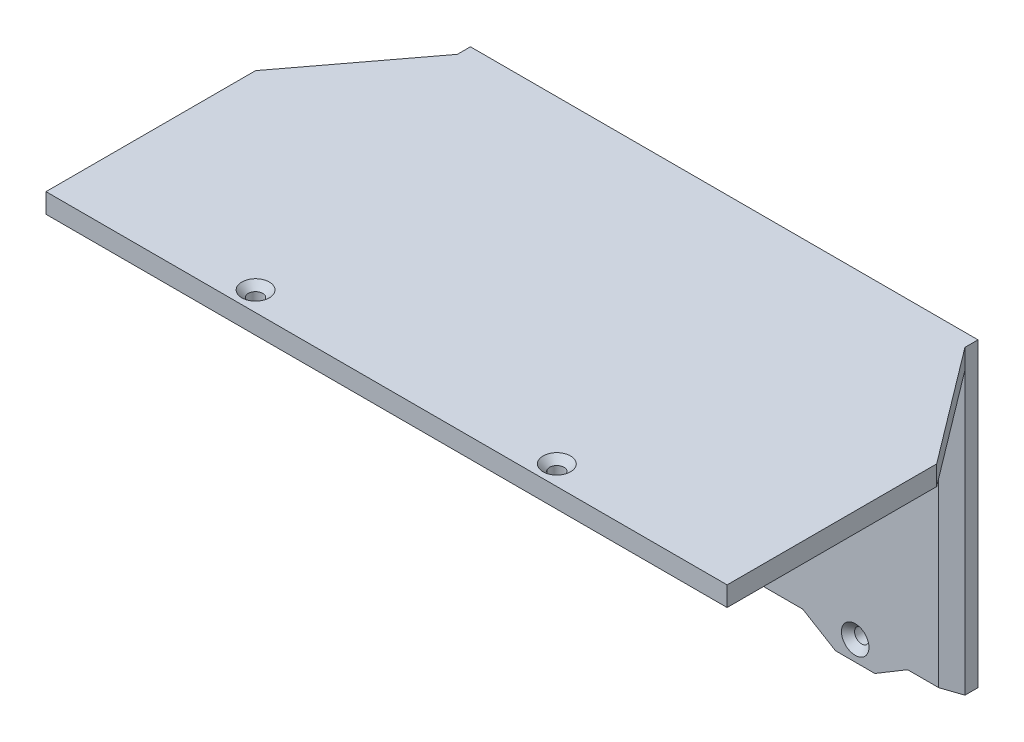
ISO-10303-21;
HEADER;
FILE_DESCRIPTION(('STEP AP214'),'2;1');
FILE_NAME('part.step','',(''),(''),'','','');
FILE_SCHEMA(('AUTOMOTIVE_DESIGN { 1 0 10303 214 1 1 1 1 }'));
ENDSEC;
DATA;
#1=APPLICATION_CONTEXT('core data for automotive mechanical design processes');
#2=APPLICATION_PROTOCOL_DEFINITION('international standard','automotive_design',2000,#1);
#3=PRODUCT_CONTEXT('',#1,'mechanical');
#4=PRODUCT('Part','Part','',(#3));
#5=PRODUCT_RELATED_PRODUCT_CATEGORY('part','',(#4));
#6=PRODUCT_DEFINITION_FORMATION('','',#4);
#7=PRODUCT_DEFINITION_CONTEXT('part definition',#1,'design');
#8=PRODUCT_DEFINITION('design','',#6,#7);
#9=PRODUCT_DEFINITION_SHAPE('','',#8);
#10=(LENGTH_UNIT() NAMED_UNIT(*) SI_UNIT(.MILLI.,.METRE.));
#11=(NAMED_UNIT(*) PLANE_ANGLE_UNIT() SI_UNIT($,.RADIAN.));
#12=(NAMED_UNIT(*) SI_UNIT($,.STERADIAN.) SOLID_ANGLE_UNIT());
#13=UNCERTAINTY_MEASURE_WITH_UNIT(LENGTH_MEASURE(1.E-05),#10,'distance_accuracy_value','');
#14=(GEOMETRIC_REPRESENTATION_CONTEXT(3) GLOBAL_UNCERTAINTY_ASSIGNED_CONTEXT((#13)) GLOBAL_UNIT_ASSIGNED_CONTEXT((#10,
#11,#12)) REPRESENTATION_CONTEXT('',''));
#15=CARTESIAN_POINT('',(0.,0.,0.));
#16=DIRECTION('',(0.,0.,1.));
#17=DIRECTION('',(1.,0.,0.));
#18=AXIS2_PLACEMENT_3D('',#15,#16,#17);
#19=CARTESIAN_POINT('',(0.,3.,0.));
#20=DIRECTION('',(0.,1.,0.));
#21=DIRECTION('',(0.,0.,1.));
#22=AXIS2_PLACEMENT_3D('',#19,#20,#21);
#23=PLANE('',#22);
#24=CARTESIAN_POINT('',(23.0000000000002,3.,72.7452578391736));
#25=DIRECTION('',(0.,1.,0.));
#26=DIRECTION('',(0.,0.,1.));
#27=AXIS2_PLACEMENT_3D('',#24,#25,#26);
#28=CIRCLE('',#27,2.09999999999998);
#29=CARTESIAN_POINT('',(23.0000000000002,3.,74.8452578391735));
#30=VERTEX_POINT('',#29);
#31=EDGE_CURVE('E330',#30,#30,#28,.F.);
#32=ORIENTED_EDGE('',*,*,#31,.T.);
#33=EDGE_LOOP('',(#32));
#34=FACE_BOUND('',#33,.T.);
#35=CARTESIAN_POINT('',(-22.9999999999998,3.,72.7452578391736));
#36=DIRECTION('',(0.,1.,0.));
#37=DIRECTION('',(0.,0.,1.));
#38=AXIS2_PLACEMENT_3D('',#35,#36,#37);
#39=CIRCLE('',#38,2.09999999999999);
#40=CARTESIAN_POINT('',(-22.9999999999998,3.,74.8452578391735));
#41=VERTEX_POINT('',#40);
#42=EDGE_CURVE('E318',#41,#41,#39,.F.);
#43=ORIENTED_EDGE('',*,*,#42,.T.);
#44=EDGE_LOOP('',(#43));
#45=FACE_BOUND('',#44,.T.);
#46=DIRECTION('',(0.602272727272727,0.,0.798290399531068));
#47=VECTOR('',#46,1.);
#48=CARTESIAN_POINT('',(12.1056947461493,3.,-9.13317984855799));
#49=LINE('',#48,#47);
#50=CARTESIAN_POINT('',(38.7500000000002,3.,26.1828690494901));
#51=VERTEX_POINT('',#50);
#52=CARTESIAN_POINT('',(52.0000000000002,3.,43.7452578391736));
#53=VERTEX_POINT('',#52);
#54=EDGE_CURVE('E246',#51,#53,#49,.T.);
#55=ORIENTED_EDGE('',*,*,#54,.F.);
#56=DIRECTION('',(0.,0.,1.));
#57=VECTOR('',#56,1.);
#58=CARTESIAN_POINT('',(38.7500000000002,3.,0.));
#59=LINE('',#58,#57);
#60=CARTESIAN_POINT('',(38.7500000000002,3.,24.1876112103165));
#61=VERTEX_POINT('',#60);
#62=EDGE_CURVE('E250',#61,#51,#59,.T.);
#63=ORIENTED_EDGE('',*,*,#62,.F.);
#64=DIRECTION('',(1.,0.,0.));
#65=VECTOR('',#64,1.);
#66=CARTESIAN_POINT('',(0.,3.,24.1876112103165));
#67=LINE('',#66,#65);
#68=CARTESIAN_POINT('',(-38.7499999999998,3.,24.1876112103165));
#69=VERTEX_POINT('',#68);
#70=EDGE_CURVE('E255',#69,#61,#67,.T.);
#71=ORIENTED_EDGE('',*,*,#70,.F.);
#72=DIRECTION('',(0.,0.,1.));
#73=VECTOR('',#72,1.);
#74=CARTESIAN_POINT('',(-38.7499999999998,3.,0.));
#75=LINE('',#74,#73);
#76=CARTESIAN_POINT('',(-38.7499999999998,3.,26.1828690494901));
#77=VERTEX_POINT('',#76);
#78=EDGE_CURVE('E259',#69,#77,#75,.T.);
#79=ORIENTED_EDGE('',*,*,#78,.T.);
#80=DIRECTION('',(-0.602272727272728,0.,0.798290399531067));
#81=VECTOR('',#80,1.);
#82=CARTESIAN_POINT('',(-12.105694746149,3.,-9.13317984855776));
#83=LINE('',#82,#81);
#84=CARTESIAN_POINT('',(-51.9999999999998,3.,43.7452578391736));
#85=VERTEX_POINT('',#84);
#86=EDGE_CURVE('E262',#77,#85,#83,.T.);
#87=ORIENTED_EDGE('',*,*,#86,.T.);
#88=DIRECTION('',(0.,0.,1.));
#89=VECTOR('',#88,1.);
#90=CARTESIAN_POINT('',(-51.9999999999998,3.,0.));
#91=LINE('',#90,#89);
#92=CARTESIAN_POINT('',(-51.9999999999998,3.,75.7452578391735));
#93=VERTEX_POINT('',#92);
#94=EDGE_CURVE('E265',#85,#93,#91,.T.);
#95=ORIENTED_EDGE('',*,*,#94,.T.);
#96=DIRECTION('',(1.,0.,0.));
#97=VECTOR('',#96,1.);
#98=CARTESIAN_POINT('',(0.,3.,75.7452578391735));
#99=LINE('',#98,#97);
#100=CARTESIAN_POINT('',(52.0000000000002,3.,75.7452578391735));
#101=VERTEX_POINT('',#100);
#102=EDGE_CURVE('E268',#93,#101,#99,.T.);
#103=ORIENTED_EDGE('',*,*,#102,.T.);
#104=DIRECTION('',(0.,0.,-1.));
#105=VECTOR('',#104,1.);
#106=CARTESIAN_POINT('',(52.0000000000002,3.,0.));
#107=LINE('',#106,#105);
#108=EDGE_CURVE('E271',#101,#53,#107,.T.);
#109=ORIENTED_EDGE('',*,*,#108,.T.);
#110=EDGE_LOOP('',(#55,#63,#71,#79,#87,#95,#103,#109));
#111=FACE_BOUND('',#110,.T.);
#112=ADVANCED_FACE('F47',(#34,#45,#111),#23,.T.);
#113=CARTESIAN_POINT('',(0.,0.,0.));
#114=DIRECTION('',(0.,1.,0.));
#115=DIRECTION('',(0.,0.,1.));
#116=AXIS2_PLACEMENT_3D('',#113,#114,#115);
#117=PLANE('',#116);
#118=CARTESIAN_POINT('',(23.0000000000002,0.,72.7452578391736));
#119=DIRECTION('',(0.,1.,0.));
#120=DIRECTION('',(0.,0.,1.));
#121=AXIS2_PLACEMENT_3D('',#118,#119,#120);
#122=CIRCLE('',#121,1.1);
#123=CARTESIAN_POINT('',(23.0000000000002,0.,73.8452578391736));
#124=VERTEX_POINT('',#123);
#125=EDGE_CURVE('E434',#124,#124,#122,.F.);
#126=ORIENTED_EDGE('',*,*,#125,.F.);
#127=EDGE_LOOP('',(#126));
#128=FACE_BOUND('',#127,.T.);
#129=DIRECTION('',(-0.602272727272728,0.,0.798290399531067));
#130=VECTOR('',#129,1.);
#131=CARTESIAN_POINT('',(-12.105694746149,0.,-9.13317984855776));
#132=LINE('',#131,#130);
#133=CARTESIAN_POINT('',(-38.7499999999998,0.,26.1828690494901));
#134=VERTEX_POINT('',#133);
#135=CARTESIAN_POINT('',(-51.9999999999998,0.,43.7452578391736));
#136=VERTEX_POINT('',#135);
#137=EDGE_CURVE('E278',#134,#136,#132,.T.);
#138=ORIENTED_EDGE('',*,*,#137,.F.);
#139=DIRECTION('',(0.948232671745463,0.,0.317576447858561));
#140=VECTOR('',#139,1.);
#141=CARTESIAN_POINT('',(-11.7927374842157,0.,35.2112351128475));
#142=LINE('',#141,#140);
#143=CARTESIAN_POINT('',(-35.7499999999998,0.,27.1876112103164));
#144=VERTEX_POINT('',#143);
#145=EDGE_CURVE('E220',#134,#144,#142,.T.);
#146=ORIENTED_EDGE('',*,*,#145,.T.);
#147=DIRECTION('',(1.,0.,0.));
#148=VECTOR('',#147,1.);
#149=CARTESIAN_POINT('',(0.,0.,27.1876112103165));
#150=LINE('',#149,#148);
#151=CARTESIAN_POINT('',(35.7500000000002,0.,27.1876112103165));
#152=VERTEX_POINT('',#151);
#153=EDGE_CURVE('E224',#144,#152,#150,.T.);
#154=ORIENTED_EDGE('',*,*,#153,.T.);
#155=DIRECTION('',(0.948232671745458,0.,-0.317576447858576));
#156=VECTOR('',#155,1.);
#157=CARTESIAN_POINT('',(11.7927374842165,0.,35.2112351128478));
#158=LINE('',#157,#156);
#159=CARTESIAN_POINT('',(38.7500000000002,0.,26.1828690494901));
#160=VERTEX_POINT('',#159);
#161=EDGE_CURVE('E229',#152,#160,#158,.T.);
#162=ORIENTED_EDGE('',*,*,#161,.T.);
#163=DIRECTION('',(0.602272727272727,0.,0.798290399531068));
#164=VECTOR('',#163,1.);
#165=CARTESIAN_POINT('',(12.1056947461493,0.,-9.13317984855799));
#166=LINE('',#165,#164);
#167=CARTESIAN_POINT('',(52.0000000000002,0.,43.7452578391736));
#168=VERTEX_POINT('',#167);
#169=EDGE_CURVE('E237',#160,#168,#166,.T.);
#170=ORIENTED_EDGE('',*,*,#169,.T.);
#171=DIRECTION('',(0.,0.,-1.));
#172=VECTOR('',#171,1.);
#173=CARTESIAN_POINT('',(52.0000000000002,0.,0.));
#174=LINE('',#173,#172);
#175=CARTESIAN_POINT('',(52.0000000000002,0.,75.7452578391735));
#176=VERTEX_POINT('',#175);
#177=EDGE_CURVE('E251',#176,#168,#174,.T.);
#178=ORIENTED_EDGE('',*,*,#177,.F.);
#179=DIRECTION('',(1.,0.,0.));
#180=VECTOR('',#179,1.);
#181=CARTESIAN_POINT('',(0.,0.,75.7452578391735));
#182=LINE('',#181,#180);
#183=CARTESIAN_POINT('',(-51.9999999999998,0.,75.7452578391735));
#184=VERTEX_POINT('',#183);
#185=EDGE_CURVE('E284',#184,#176,#182,.T.);
#186=ORIENTED_EDGE('',*,*,#185,.F.);
#187=DIRECTION('',(0.,0.,1.));
#188=VECTOR('',#187,1.);
#189=CARTESIAN_POINT('',(-51.9999999999998,0.,0.));
#190=LINE('',#189,#188);
#191=EDGE_CURVE('E281',#136,#184,#190,.T.);
#192=ORIENTED_EDGE('',*,*,#191,.F.);
#193=EDGE_LOOP('',(#138,#146,#154,#162,#170,#178,#186,#192));
#194=FACE_BOUND('',#193,.T.);
#195=CARTESIAN_POINT('',(-22.9999999999998,0.,72.7452578391736));
#196=DIRECTION('',(0.,1.,0.));
#197=DIRECTION('',(0.,0.,1.));
#198=AXIS2_PLACEMENT_3D('',#195,#196,#197);
#199=CIRCLE('',#198,1.1);
#200=CARTESIAN_POINT('',(-22.9999999999998,0.,73.8452578391736));
#201=VERTEX_POINT('',#200);
#202=EDGE_CURVE('E436',#201,#201,#199,.T.);
#203=ORIENTED_EDGE('',*,*,#202,.T.);
#204=EDGE_LOOP('',(#203));
#205=FACE_BOUND('',#204,.T.);
#206=ADVANCED_FACE('F358',(#128,#194,#205),#117,.F.);
#207=CARTESIAN_POINT('',(0.,3.,24.1876112103165));
#208=DIRECTION('',(0.,0.,-1.));
#209=DIRECTION('',(-1.,0.,0.));
#210=AXIS2_PLACEMENT_3D('',#207,#208,#209);
#211=PLANE('',#210);
#212=DIRECTION('',(0.,-1.,0.));
#213=VECTOR('',#212,1.);
#214=CARTESIAN_POINT('',(38.7500000000002,3.,24.1876112103165));
#215=LINE('',#214,#213);
#216=CARTESIAN_POINT('',(38.7500000000002,-43.,24.1876112103165));
#217=VERTEX_POINT('',#216);
#218=EDGE_CURVE('E311',#61,#217,#215,.T.);
#219=ORIENTED_EDGE('',*,*,#218,.T.);
#220=DIRECTION('',(1.,0.,0.));
#221=VECTOR('',#220,1.);
#222=CARTESIAN_POINT('',(0.,-43.,24.1876112103165));
#223=LINE('',#222,#221);
#224=CARTESIAN_POINT('',(30.9988898767628,-43.,24.1876112103165));
#225=VERTEX_POINT('',#224);
#226=EDGE_CURVE('E211',#225,#217,#223,.T.);
#227=ORIENTED_EDGE('',*,*,#226,.F.);
#228=DIRECTION('',(0.857442517455001,0.514579759862774,0.));
#229=VECTOR('',#228,1.);
#230=CARTESIAN_POINT('',(27.1808385382651,-45.2913395369516,24.1876112103165));
#231=LINE('',#230,#229);
#232=CARTESIAN_POINT('',(26.0000000000002,-46.,24.1876112103165));
#233=VERTEX_POINT('',#232);
#234=EDGE_CURVE('E447',#233,#225,#231,.T.);
#235=ORIENTED_EDGE('',*,*,#234,.F.);
#236=DIRECTION('',(-1.,0.,0.));
#237=VECTOR('',#236,1.);
#238=CARTESIAN_POINT('',(0.,-46.,24.1876112103165));
#239=LINE('',#238,#237);
#240=CARTESIAN_POINT('',(20.0000000000002,-46.,24.1876112103165));
#241=VERTEX_POINT('',#240);
#242=EDGE_CURVE('E203',#233,#241,#239,.T.);
#243=ORIENTED_EDGE('',*,*,#242,.T.);
#244=DIRECTION('',(-0.857442517455001,0.514579759862774,0.));
#245=VECTOR('',#244,1.);
#246=CARTESIAN_POINT('',(-15.0003913922852,-24.9951015594575,24.1876112103165));
#247=LINE('',#246,#245);
#248=CARTESIAN_POINT('',(15.0011101232376,-43.,24.1876112103165));
#249=VERTEX_POINT('',#248);
#250=EDGE_CURVE('E184',#241,#249,#247,.T.);
#251=ORIENTED_EDGE('',*,*,#250,.T.);
#252=CARTESIAN_POINT('',(-15.0011101232371,-43.,24.1876112103165));
#253=VERTEX_POINT('',#252);
#254=EDGE_CURVE('E200',#253,#249,#223,.T.);
#255=ORIENTED_EDGE('',*,*,#254,.F.);
#256=DIRECTION('',(0.857442517455002,0.514579759862773,0.));
#257=VECTOR('',#256,1.);
#258=CARTESIAN_POINT('',(15.0003913922853,-24.9951015594578,24.1876112103165));
#259=LINE('',#258,#257);
#260=CARTESIAN_POINT('',(-19.9999999999998,-46.,24.1876112103165));
#261=VERTEX_POINT('',#260);
#262=EDGE_CURVE('E489',#261,#253,#259,.T.);
#263=ORIENTED_EDGE('',*,*,#262,.F.);
#264=DIRECTION('',(1.,0.,0.));
#265=VECTOR('',#264,1.);
#266=CARTESIAN_POINT('',(0.,-46.,24.1876112103165));
#267=LINE('',#266,#265);
#268=CARTESIAN_POINT('',(-25.9999999999998,-46.,24.1876112103165));
#269=VERTEX_POINT('',#268);
#270=EDGE_CURVE('E485',#269,#261,#267,.T.);
#271=ORIENTED_EDGE('',*,*,#270,.F.);
#272=DIRECTION('',(-0.857442517455002,0.514579759862773,0.));
#273=VECTOR('',#272,1.);
#274=CARTESIAN_POINT('',(-27.1808385382649,-45.2913395369514,24.1876112103165));
#275=LINE('',#274,#273);
#276=CARTESIAN_POINT('',(-30.9988898767624,-43.,24.1876112103165));
#277=VERTEX_POINT('',#276);
#278=EDGE_CURVE('E225',#269,#277,#275,.T.);
#279=ORIENTED_EDGE('',*,*,#278,.T.);
#280=CARTESIAN_POINT('',(-38.7499999999998,-43.,24.1876112103165));
#281=VERTEX_POINT('',#280);
#282=EDGE_CURVE('E210',#281,#277,#223,.T.);
#283=ORIENTED_EDGE('',*,*,#282,.F.);
#284=DIRECTION('',(0.,-1.,0.));
#285=VECTOR('',#284,1.);
#286=CARTESIAN_POINT('',(-38.7499999999998,3.,24.1876112103165));
#287=LINE('',#286,#285);
#288=EDGE_CURVE('E308',#69,#281,#287,.T.);
#289=ORIENTED_EDGE('',*,*,#288,.F.);
#290=ORIENTED_EDGE('',*,*,#70,.T.);
#291=EDGE_LOOP('',(#219,#227,#235,#243,#251,#255,#263,#271,#279,#283,#289,#290));
#292=FACE_BOUND('',#291,.T.);
#293=CARTESIAN_POINT('',(23.0000000000002,-43.,24.1876112103165));
#294=DIRECTION('',(0.,0.,-1.));
#295=DIRECTION('',(-1.,0.,0.));
#296=AXIS2_PLACEMENT_3D('',#293,#294,#295);
#297=CIRCLE('',#296,1.1);
#298=CARTESIAN_POINT('',(21.9000000000002,-43.,24.1876112103165));
#299=VERTEX_POINT('',#298);
#300=EDGE_CURVE('E440',#299,#299,#297,.F.);
#301=ORIENTED_EDGE('',*,*,#300,.T.);
#302=EDGE_LOOP('',(#301));
#303=FACE_BOUND('',#302,.T.);
#304=CARTESIAN_POINT('',(-22.9999999999998,-43.,24.1876112103165));
#305=DIRECTION('',(0.,0.,-1.));
#306=DIRECTION('',(-1.,0.,0.));
#307=AXIS2_PLACEMENT_3D('',#304,#305,#306);
#308=CIRCLE('',#307,1.1);
#309=CARTESIAN_POINT('',(-24.0999999999998,-43.,24.1876112103165));
#310=VERTEX_POINT('',#309);
#311=EDGE_CURVE('E443',#310,#310,#308,.T.);
#312=ORIENTED_EDGE('',*,*,#311,.F.);
#313=EDGE_LOOP('',(#312));
#314=FACE_BOUND('',#313,.T.);
#315=ADVANCED_FACE('F197',(#292,#303,#314),#211,.T.);
#316=CARTESIAN_POINT('',(0.,-43.,27.1876112103165));
#317=DIRECTION('',(0.,0.,1.));
#318=DIRECTION('',(1.,0.,0.));
#319=AXIS2_PLACEMENT_3D('',#316,#317,#318);
#320=PLANE('',#319);
#321=CARTESIAN_POINT('',(-22.9999999999998,-43.,27.1876112103164));
#322=DIRECTION('',(0.,0.,1.));
#323=DIRECTION('',(1.,0.,0.));
#324=AXIS2_PLACEMENT_3D('',#321,#322,#323);
#325=CIRCLE('',#324,2.09999999999997);
#326=CARTESIAN_POINT('',(-20.8999999999998,-43.,27.1876112103164));
#327=VERTEX_POINT('',#326);
#328=EDGE_CURVE('E57',#327,#327,#325,.F.);
#329=ORIENTED_EDGE('',*,*,#328,.T.);
#330=EDGE_LOOP('',(#329));
#331=FACE_BOUND('',#330,.T.);
#332=CARTESIAN_POINT('',(23.0000000000002,-43.,27.1876112103165));
#333=DIRECTION('',(0.,0.,1.));
#334=DIRECTION('',(1.,0.,0.));
#335=AXIS2_PLACEMENT_3D('',#332,#333,#334);
#336=CIRCLE('',#335,2.1);
#337=CARTESIAN_POINT('',(25.1000000000002,-43.,27.1876112103165));
#338=VERTEX_POINT('',#337);
#339=EDGE_CURVE('E338',#338,#338,#336,.F.);
#340=ORIENTED_EDGE('',*,*,#339,.T.);
#341=EDGE_LOOP('',(#340));
#342=FACE_BOUND('',#341,.T.);
#343=ORIENTED_EDGE('',*,*,#153,.F.);
#344=DIRECTION('',(0.,1.,0.));
#345=VECTOR('',#344,1.);
#346=CARTESIAN_POINT('',(-35.7499999999998,-43.,27.1876112103164));
#347=LINE('',#346,#345);
#348=CARTESIAN_POINT('',(-35.7499999999998,-43.,27.1876112103164));
#349=VERTEX_POINT('',#348);
#350=EDGE_CURVE('E241',#349,#144,#347,.T.);
#351=ORIENTED_EDGE('',*,*,#350,.F.);
#352=DIRECTION('',(1.,0.,0.));
#353=VECTOR('',#352,1.);
#354=CARTESIAN_POINT('',(0.,-43.,27.1876112103165));
#355=LINE('',#354,#353);
#356=CARTESIAN_POINT('',(-30.9988898767624,-43.,27.1876112103164));
#357=VERTEX_POINT('',#356);
#358=EDGE_CURVE('E511',#349,#357,#355,.T.);
#359=ORIENTED_EDGE('',*,*,#358,.T.);
#360=DIRECTION('',(-0.857442517455002,0.514579759862773,0.));
#361=VECTOR('',#360,1.);
#362=CARTESIAN_POINT('',(-27.1808385382649,-45.2913395369514,27.1876112103165));
#363=LINE('',#362,#361);
#364=CARTESIAN_POINT('',(-25.9999999999998,-46.,27.1876112103165));
#365=VERTEX_POINT('',#364);
#366=EDGE_CURVE('E480',#365,#357,#363,.T.);
#367=ORIENTED_EDGE('',*,*,#366,.F.);
#368=DIRECTION('',(1.,0.,0.));
#369=VECTOR('',#368,1.);
#370=CARTESIAN_POINT('',(0.,-46.,27.1876112103165));
#371=LINE('',#370,#369);
#372=CARTESIAN_POINT('',(-19.9999999999998,-46.,27.1876112103165));
#373=VERTEX_POINT('',#372);
#374=EDGE_CURVE('E476',#365,#373,#371,.T.);
#375=ORIENTED_EDGE('',*,*,#374,.T.);
#376=DIRECTION('',(0.857442517455002,0.514579759862773,0.));
#377=VECTOR('',#376,1.);
#378=CARTESIAN_POINT('',(15.0003913922853,-24.9951015594578,27.1876112103165));
#379=LINE('',#378,#377);
#380=CARTESIAN_POINT('',(-15.0011101232371,-43.,27.1876112103165));
#381=VERTEX_POINT('',#380);
#382=EDGE_CURVE('E472',#373,#381,#379,.T.);
#383=ORIENTED_EDGE('',*,*,#382,.T.);
#384=CARTESIAN_POINT('',(15.0011101232376,-43.,27.1876112103165));
#385=VERTEX_POINT('',#384);
#386=EDGE_CURVE('E514',#381,#385,#355,.T.);
#387=ORIENTED_EDGE('',*,*,#386,.T.);
#388=DIRECTION('',(-0.857442517455001,0.514579759862774,0.));
#389=VECTOR('',#388,1.);
#390=CARTESIAN_POINT('',(-15.0003913922852,-24.9951015594575,27.1876112103165));
#391=LINE('',#390,#389);
#392=CARTESIAN_POINT('',(20.0000000000002,-46.,27.1876112103165));
#393=VERTEX_POINT('',#392);
#394=EDGE_CURVE('E187',#393,#385,#391,.T.);
#395=ORIENTED_EDGE('',*,*,#394,.F.);
#396=DIRECTION('',(-1.,0.,0.));
#397=VECTOR('',#396,1.);
#398=CARTESIAN_POINT('',(0.,-46.,27.1876112103165));
#399=LINE('',#398,#397);
#400=CARTESIAN_POINT('',(26.0000000000002,-46.,27.1876112103165));
#401=VERTEX_POINT('',#400);
#402=EDGE_CURVE('E451',#401,#393,#399,.T.);
#403=ORIENTED_EDGE('',*,*,#402,.F.);
#404=DIRECTION('',(0.857442517455001,0.514579759862774,0.));
#405=VECTOR('',#404,1.);
#406=CARTESIAN_POINT('',(27.1808385382651,-45.2913395369516,27.1876112103165));
#407=LINE('',#406,#405);
#408=CARTESIAN_POINT('',(30.9988898767628,-43.,27.1876112103165));
#409=VERTEX_POINT('',#408);
#410=EDGE_CURVE('E64',#401,#409,#407,.T.);
#411=ORIENTED_EDGE('',*,*,#410,.T.);
#412=CARTESIAN_POINT('',(35.7500000000002,-43.,27.1876112103165));
#413=VERTEX_POINT('',#412);
#414=EDGE_CURVE('E510',#409,#413,#355,.T.);
#415=ORIENTED_EDGE('',*,*,#414,.T.);
#416=DIRECTION('',(0.,1.,0.));
#417=VECTOR('',#416,1.);
#418=CARTESIAN_POINT('',(35.7500000000002,-43.,27.1876112103165));
#419=LINE('',#418,#417);
#420=EDGE_CURVE('E238',#413,#152,#419,.T.);
#421=ORIENTED_EDGE('',*,*,#420,.T.);
#422=EDGE_LOOP('',(#343,#351,#359,#367,#375,#383,#387,#395,#403,#411,#415,#421));
#423=FACE_BOUND('',#422,.T.);
#424=ADVANCED_FACE('F345',(#331,#342,#423),#320,.T.);
#425=CARTESIAN_POINT('',(0.,-43.,0.));
#426=DIRECTION('',(0.,1.,0.));
#427=DIRECTION('',(0.,0.,1.));
#428=AXIS2_PLACEMENT_3D('',#425,#426,#427);
#429=PLANE('',#428);
#430=DIRECTION('',(0.,0.,1.));
#431=VECTOR('',#430,1.);
#432=CARTESIAN_POINT('',(15.0011101232376,-43.,7.91097282758205));
#433=LINE('',#432,#431);
#434=EDGE_CURVE('E181',#249,#385,#433,.T.);
#435=ORIENTED_EDGE('',*,*,#434,.T.);
#436=ORIENTED_EDGE('',*,*,#386,.F.);
#437=DIRECTION('',(0.,0.,1.));
#438=VECTOR('',#437,1.);
#439=CARTESIAN_POINT('',(-15.0011101232371,-43.,7.91097282758205));
#440=LINE('',#439,#438);
#441=EDGE_CURVE('E208',#253,#381,#440,.T.);
#442=ORIENTED_EDGE('',*,*,#441,.F.);
#443=ORIENTED_EDGE('',*,*,#254,.T.);
#444=EDGE_LOOP('',(#435,#436,#442,#443));
#445=FACE_BOUND('',#444,.T.);
#446=ADVANCED_FACE('F206',(#445),#429,.F.);
#447=ORIENTED_EDGE('',*,*,#414,.F.);
#448=DIRECTION('',(0.,0.,1.));
#449=VECTOR('',#448,1.);
#450=CARTESIAN_POINT('',(30.9988898767628,-43.,7.91097282758205));
#451=LINE('',#450,#449);
#452=EDGE_CURVE('E465',#225,#409,#451,.T.);
#453=ORIENTED_EDGE('',*,*,#452,.F.);
#454=ORIENTED_EDGE('',*,*,#226,.T.);
#455=DIRECTION('',(0.,0.,1.));
#456=VECTOR('',#455,1.);
#457=CARTESIAN_POINT('',(38.7500000000002,-43.,0.));
#458=LINE('',#457,#456);
#459=CARTESIAN_POINT('',(38.7500000000002,-43.,26.1828690494901));
#460=VERTEX_POINT('',#459);
#461=EDGE_CURVE('E216',#217,#460,#458,.T.);
#462=ORIENTED_EDGE('',*,*,#461,.T.);
#463=DIRECTION('',(0.948232671745458,0.,-0.317576447858576));
#464=VECTOR('',#463,1.);
#465=CARTESIAN_POINT('',(11.7927374842165,-43.,35.2112351128478));
#466=LINE('',#465,#464);
#467=EDGE_CURVE('E513',#413,#460,#466,.T.);
#468=ORIENTED_EDGE('',*,*,#467,.F.);
#469=EDGE_LOOP('',(#447,#453,#454,#462,#468));
#470=FACE_BOUND('',#469,.T.);
#471=ADVANCED_FACE('F401',(#470),#429,.F.);
#472=CARTESIAN_POINT('',(12.1056947461493,3.,-9.13317984855799));
#473=DIRECTION('',(0.798290399531068,0.,-0.602272727272727));
#474=DIRECTION('',(-0.602272727272727,0.,-0.798290399531068));
#475=AXIS2_PLACEMENT_3D('',#472,#473,#474);
#476=PLANE('',#475);
#477=ORIENTED_EDGE('',*,*,#169,.F.);
#478=DIRECTION('',(0.,-1.,0.));
#479=VECTOR('',#478,1.);
#480=CARTESIAN_POINT('',(38.7500000000002,3.,26.1828690494901));
#481=LINE('',#480,#479);
#482=EDGE_CURVE('E314',#51,#160,#481,.T.);
#483=ORIENTED_EDGE('',*,*,#482,.F.);
#484=ORIENTED_EDGE('',*,*,#54,.T.);
#485=DIRECTION('',(0.,-1.,0.));
#486=VECTOR('',#485,1.);
#487=CARTESIAN_POINT('',(52.0000000000002,3.,43.7452578391736));
#488=LINE('',#487,#486);
#489=EDGE_CURVE('E274',#53,#168,#488,.T.);
#490=ORIENTED_EDGE('',*,*,#489,.T.);
#491=EDGE_LOOP('',(#477,#483,#484,#490));
#492=FACE_BOUND('',#491,.T.);
#493=ADVANCED_FACE('F397',(#492),#476,.T.);
#494=CARTESIAN_POINT('',(38.7500000000002,3.,0.));
#495=DIRECTION('',(1.,0.,0.));
#496=DIRECTION('',(0.,0.,-1.));
#497=AXIS2_PLACEMENT_3D('',#494,#495,#496);
#498=PLANE('',#497);
#499=ORIENTED_EDGE('',*,*,#482,.T.);
#500=DIRECTION('',(0.,1.,0.));
#501=VECTOR('',#500,1.);
#502=CARTESIAN_POINT('',(38.7500000000002,-43.,26.1828690494901));
#503=LINE('',#502,#501);
#504=EDGE_CURVE('E234',#460,#160,#503,.T.);
#505=ORIENTED_EDGE('',*,*,#504,.F.);
#506=ORIENTED_EDGE('',*,*,#461,.F.);
#507=ORIENTED_EDGE('',*,*,#218,.F.);
#508=ORIENTED_EDGE('',*,*,#62,.T.);
#509=EDGE_LOOP('',(#499,#505,#506,#507,#508));
#510=FACE_BOUND('',#509,.T.);
#511=ADVANCED_FACE('F391',(#510),#498,.T.);
#512=CARTESIAN_POINT('',(-38.7499999999998,3.,0.));
#513=DIRECTION('',(1.,0.,0.));
#514=DIRECTION('',(0.,0.,-1.));
#515=AXIS2_PLACEMENT_3D('',#512,#513,#514);
#516=PLANE('',#515);
#517=ORIENTED_EDGE('',*,*,#288,.T.);
#518=DIRECTION('',(0.,0.,1.));
#519=VECTOR('',#518,1.);
#520=CARTESIAN_POINT('',(-38.7499999999998,-43.,0.));
#521=LINE('',#520,#519);
#522=CARTESIAN_POINT('',(-38.7499999999998,-43.,26.1828690494901));
#523=VERTEX_POINT('',#522);
#524=EDGE_CURVE('E233',#281,#523,#521,.T.);
#525=ORIENTED_EDGE('',*,*,#524,.T.);
#526=DIRECTION('',(0.,1.,0.));
#527=VECTOR('',#526,1.);
#528=CARTESIAN_POINT('',(-38.7499999999998,-43.,26.1828690494901));
#529=LINE('',#528,#527);
#530=EDGE_CURVE('E215',#523,#134,#529,.T.);
#531=ORIENTED_EDGE('',*,*,#530,.T.);
#532=DIRECTION('',(0.,-1.,0.));
#533=VECTOR('',#532,1.);
#534=CARTESIAN_POINT('',(-38.7499999999998,3.,26.1828690494901));
#535=LINE('',#534,#533);
#536=EDGE_CURVE('E304',#77,#134,#535,.T.);
#537=ORIENTED_EDGE('',*,*,#536,.F.);
#538=ORIENTED_EDGE('',*,*,#78,.F.);
#539=EDGE_LOOP('',(#517,#525,#531,#537,#538));
#540=FACE_BOUND('',#539,.T.);
#541=ADVANCED_FACE('F387',(#540),#516,.F.);
#542=CARTESIAN_POINT('',(-12.105694746149,3.,-9.13317984855776));
#543=DIRECTION('',(0.798290399531067,0.,0.602272727272728));
#544=DIRECTION('',(0.602272727272728,0.,-0.798290399531067));
#545=AXIS2_PLACEMENT_3D('',#542,#543,#544);
#546=PLANE('',#545);
#547=ORIENTED_EDGE('',*,*,#137,.T.);
#548=DIRECTION('',(0.,-1.,0.));
#549=VECTOR('',#548,1.);
#550=CARTESIAN_POINT('',(-51.9999999999998,3.,43.7452578391736));
#551=LINE('',#550,#549);
#552=EDGE_CURVE('E300',#85,#136,#551,.T.);
#553=ORIENTED_EDGE('',*,*,#552,.F.);
#554=ORIENTED_EDGE('',*,*,#86,.F.);
#555=ORIENTED_EDGE('',*,*,#536,.T.);
#556=EDGE_LOOP('',(#547,#553,#554,#555));
#557=FACE_BOUND('',#556,.T.);
#558=ADVANCED_FACE('F383',(#557),#546,.F.);
#559=CARTESIAN_POINT('',(-51.9999999999998,3.,0.));
#560=DIRECTION('',(1.,0.,0.));
#561=DIRECTION('',(0.,0.,-1.));
#562=AXIS2_PLACEMENT_3D('',#559,#560,#561);
#563=PLANE('',#562);
#564=ORIENTED_EDGE('',*,*,#191,.T.);
#565=DIRECTION('',(0.,-1.,0.));
#566=VECTOR('',#565,1.);
#567=CARTESIAN_POINT('',(-51.9999999999998,3.,75.7452578391735));
#568=LINE('',#567,#566);
#569=EDGE_CURVE('E296',#93,#184,#568,.T.);
#570=ORIENTED_EDGE('',*,*,#569,.F.);
#571=ORIENTED_EDGE('',*,*,#94,.F.);
#572=ORIENTED_EDGE('',*,*,#552,.T.);
#573=EDGE_LOOP('',(#564,#570,#571,#572));
#574=FACE_BOUND('',#573,.T.);
#575=ADVANCED_FACE('F379',(#574),#563,.F.);
#576=CARTESIAN_POINT('',(0.,3.,75.7452578391735));
#577=DIRECTION('',(0.,0.,-1.));
#578=DIRECTION('',(-1.,0.,0.));
#579=AXIS2_PLACEMENT_3D('',#576,#577,#578);
#580=PLANE('',#579);
#581=ORIENTED_EDGE('',*,*,#185,.T.);
#582=DIRECTION('',(0.,-1.,0.));
#583=VECTOR('',#582,1.);
#584=CARTESIAN_POINT('',(52.0000000000002,3.,75.7452578391735));
#585=LINE('',#584,#583);
#586=EDGE_CURVE('E292',#101,#176,#585,.T.);
#587=ORIENTED_EDGE('',*,*,#586,.F.);
#588=ORIENTED_EDGE('',*,*,#102,.F.);
#589=ORIENTED_EDGE('',*,*,#569,.T.);
#590=EDGE_LOOP('',(#581,#587,#588,#589));
#591=FACE_BOUND('',#590,.T.);
#592=ADVANCED_FACE('F375',(#591),#580,.F.);
#593=CARTESIAN_POINT('',(52.0000000000002,3.,0.));
#594=DIRECTION('',(-1.,0.,0.));
#595=DIRECTION('',(0.,0.,1.));
#596=AXIS2_PLACEMENT_3D('',#593,#594,#595);
#597=PLANE('',#596);
#598=ORIENTED_EDGE('',*,*,#177,.T.);
#599=ORIENTED_EDGE('',*,*,#489,.F.);
#600=ORIENTED_EDGE('',*,*,#108,.F.);
#601=ORIENTED_EDGE('',*,*,#586,.T.);
#602=EDGE_LOOP('',(#598,#599,#600,#601));
#603=FACE_BOUND('',#602,.T.);
#604=ADVANCED_FACE('F371',(#603),#597,.F.);
#605=CARTESIAN_POINT('',(11.7927374842165,-43.,35.2112351128478));
#606=DIRECTION('',(0.317576447858576,0.,0.948232671745458));
#607=DIRECTION('',(0.948232671745458,0.,-0.317576447858576));
#608=AXIS2_PLACEMENT_3D('',#605,#606,#607);
#609=PLANE('',#608);
#610=ORIENTED_EDGE('',*,*,#161,.F.);
#611=ORIENTED_EDGE('',*,*,#420,.F.);
#612=ORIENTED_EDGE('',*,*,#467,.T.);
#613=ORIENTED_EDGE('',*,*,#504,.T.);
#614=EDGE_LOOP('',(#610,#611,#612,#613));
#615=FACE_BOUND('',#614,.T.);
#616=ADVANCED_FACE('F374',(#615),#609,.T.);
#617=CARTESIAN_POINT('',(-11.7927374842157,-43.,35.2112351128475));
#618=DIRECTION('',(-0.317576447858561,0.,0.948232671745463));
#619=DIRECTION('',(0.948232671745463,0.,0.317576447858561));
#620=AXIS2_PLACEMENT_3D('',#617,#618,#619);
#621=PLANE('',#620);
#622=ORIENTED_EDGE('',*,*,#145,.F.);
#623=ORIENTED_EDGE('',*,*,#530,.F.);
#624=DIRECTION('',(0.948232671745463,0.,0.317576447858561));
#625=VECTOR('',#624,1.);
#626=CARTESIAN_POINT('',(-11.7927374842157,-43.,35.2112351128475));
#627=LINE('',#626,#625);
#628=EDGE_CURVE('E506',#523,#349,#627,.T.);
#629=ORIENTED_EDGE('',*,*,#628,.T.);
#630=ORIENTED_EDGE('',*,*,#350,.T.);
#631=EDGE_LOOP('',(#622,#623,#629,#630));
#632=FACE_BOUND('',#631,.T.);
#633=ADVANCED_FACE('F368',(#632),#621,.T.);
#634=ORIENTED_EDGE('',*,*,#282,.T.);
#635=DIRECTION('',(0.,0.,1.));
#636=VECTOR('',#635,1.);
#637=CARTESIAN_POINT('',(-30.9988898767624,-43.,7.91097282758205));
#638=LINE('',#637,#636);
#639=EDGE_CURVE('E72',#277,#357,#638,.T.);
#640=ORIENTED_EDGE('',*,*,#639,.T.);
#641=ORIENTED_EDGE('',*,*,#358,.F.);
#642=ORIENTED_EDGE('',*,*,#628,.F.);
#643=ORIENTED_EDGE('',*,*,#524,.F.);
#644=EDGE_LOOP('',(#634,#640,#641,#642,#643));
#645=FACE_BOUND('',#644,.T.);
#646=ADVANCED_FACE('F551',(#645),#429,.F.);
#647=CARTESIAN_POINT('',(15.0003913922853,-24.9951015594578,7.91097282758205));
#648=DIRECTION('',(0.514579759862773,-0.857442517455002,0.));
#649=DIRECTION('',(0.857442517455002,0.514579759862773,0.));
#650=AXIS2_PLACEMENT_3D('',#647,#648,#649);
#651=PLANE('',#650);
#652=DIRECTION('',(0.,0.,1.));
#653=VECTOR('',#652,1.);
#654=CARTESIAN_POINT('',(-19.9999999999998,-46.,7.91097282758205));
#655=LINE('',#654,#653);
#656=EDGE_CURVE('E488',#261,#373,#655,.T.);
#657=ORIENTED_EDGE('',*,*,#656,.F.);
#658=ORIENTED_EDGE('',*,*,#262,.T.);
#659=ORIENTED_EDGE('',*,*,#441,.T.);
#660=ORIENTED_EDGE('',*,*,#382,.F.);
#661=EDGE_LOOP('',(#657,#658,#659,#660));
#662=FACE_BOUND('',#661,.T.);
#663=ADVANCED_FACE('F540',(#662),#651,.T.);
#664=CARTESIAN_POINT('',(0.,-46.,7.91097282758205));
#665=DIRECTION('',(0.,-1.,0.));
#666=DIRECTION('',(0.,0.,-1.));
#667=AXIS2_PLACEMENT_3D('',#664,#665,#666);
#668=PLANE('',#667);
#669=DIRECTION('',(0.,0.,1.));
#670=VECTOR('',#669,1.);
#671=CARTESIAN_POINT('',(-25.9999999999998,-46.,7.91097282758205));
#672=LINE('',#671,#670);
#673=EDGE_CURVE('E484',#269,#365,#672,.T.);
#674=ORIENTED_EDGE('',*,*,#673,.F.);
#675=ORIENTED_EDGE('',*,*,#270,.T.);
#676=ORIENTED_EDGE('',*,*,#656,.T.);
#677=ORIENTED_EDGE('',*,*,#374,.F.);
#678=EDGE_LOOP('',(#674,#675,#676,#677));
#679=FACE_BOUND('',#678,.T.);
#680=ADVANCED_FACE('F545',(#679),#668,.T.);
#681=CARTESIAN_POINT('',(-27.1808385382649,-45.2913395369514,7.91097282758205));
#682=DIRECTION('',(0.514579759862773,0.857442517455002,0.));
#683=DIRECTION('',(-0.857442517455002,0.514579759862773,0.));
#684=AXIS2_PLACEMENT_3D('',#681,#682,#683);
#685=PLANE('',#684);
#686=ORIENTED_EDGE('',*,*,#278,.F.);
#687=ORIENTED_EDGE('',*,*,#673,.T.);
#688=ORIENTED_EDGE('',*,*,#366,.T.);
#689=ORIENTED_EDGE('',*,*,#639,.F.);
#690=EDGE_LOOP('',(#686,#687,#688,#689));
#691=FACE_BOUND('',#690,.T.);
#692=ADVANCED_FACE('F549',(#691),#685,.F.);
#693=CARTESIAN_POINT('',(27.1808385382651,-45.2913395369516,7.91097282758205));
#694=DIRECTION('',(0.514579759862774,-0.857442517455001,0.));
#695=DIRECTION('',(0.857442517455001,0.514579759862774,0.));
#696=AXIS2_PLACEMENT_3D('',#693,#694,#695);
#697=PLANE('',#696);
#698=DIRECTION('',(0.,0.,1.));
#699=VECTOR('',#698,1.);
#700=CARTESIAN_POINT('',(26.0000000000002,-46.,7.91097282758205));
#701=LINE('',#700,#699);
#702=EDGE_CURVE('E456',#233,#401,#701,.T.);
#703=ORIENTED_EDGE('',*,*,#702,.F.);
#704=ORIENTED_EDGE('',*,*,#234,.T.);
#705=ORIENTED_EDGE('',*,*,#452,.T.);
#706=ORIENTED_EDGE('',*,*,#410,.F.);
#707=EDGE_LOOP('',(#703,#704,#705,#706));
#708=FACE_BOUND('',#707,.T.);
#709=ADVANCED_FACE('F563',(#708),#697,.T.);
#710=CARTESIAN_POINT('',(0.,-46.,7.91097282758205));
#711=DIRECTION('',(0.,1.,0.));
#712=DIRECTION('',(0.,0.,1.));
#713=AXIS2_PLACEMENT_3D('',#710,#711,#712);
#714=PLANE('',#713);
#715=ORIENTED_EDGE('',*,*,#242,.F.);
#716=ORIENTED_EDGE('',*,*,#702,.T.);
#717=ORIENTED_EDGE('',*,*,#402,.T.);
#718=DIRECTION('',(0.,0.,1.));
#719=VECTOR('',#718,1.);
#720=CARTESIAN_POINT('',(20.0000000000002,-46.,7.91097282758205));
#721=LINE('',#720,#719);
#722=EDGE_CURVE('E455',#241,#393,#721,.T.);
#723=ORIENTED_EDGE('',*,*,#722,.F.);
#724=EDGE_LOOP('',(#715,#716,#717,#723));
#725=FACE_BOUND('',#724,.T.);
#726=ADVANCED_FACE('F565',(#725),#714,.F.);
#727=CARTESIAN_POINT('',(-15.0003913922852,-24.9951015594575,7.91097282758205));
#728=DIRECTION('',(0.514579759862774,0.857442517455001,0.));
#729=DIRECTION('',(-0.857442517455001,0.514579759862774,0.));
#730=AXIS2_PLACEMENT_3D('',#727,#728,#729);
#731=PLANE('',#730);
#732=ORIENTED_EDGE('',*,*,#250,.F.);
#733=ORIENTED_EDGE('',*,*,#722,.T.);
#734=ORIENTED_EDGE('',*,*,#394,.T.);
#735=ORIENTED_EDGE('',*,*,#434,.F.);
#736=EDGE_LOOP('',(#732,#733,#734,#735));
#737=FACE_BOUND('',#736,.T.);
#738=ADVANCED_FACE('F183',(#737),#731,.F.);
#739=CARTESIAN_POINT('',(23.0000000000002,-43.,21.0763413730957));
#740=DIRECTION('',(0.,0.,1.));
#741=DIRECTION('',(1.,0.,0.));
#742=AXIS2_PLACEMENT_3D('',#739,#740,#741);
#743=CYLINDRICAL_SURFACE('',#742,1.1);
#744=CARTESIAN_POINT('',(23.0000000000002,-43.,26.1876112103165));
#745=DIRECTION('',(0.,0.,1.));
#746=DIRECTION('',(1.,0.,0.));
#747=AXIS2_PLACEMENT_3D('',#744,#745,#746);
#748=CIRCLE('',#747,1.1);
#749=CARTESIAN_POINT('',(24.1000000000002,-43.,26.1876112103165));
#750=VERTEX_POINT('',#749);
#751=EDGE_CURVE('E334',#750,#750,#748,.T.);
#752=ORIENTED_EDGE('',*,*,#751,.T.);
#753=EDGE_LOOP('',(#752));
#754=FACE_BOUND('',#753,.T.);
#755=ORIENTED_EDGE('',*,*,#300,.F.);
#756=EDGE_LOOP('',(#755));
#757=FACE_BOUND('',#756,.T.);
#758=ADVANCED_FACE('F572',(#754,#757),#743,.F.);
#759=CARTESIAN_POINT('',(-22.9999999999998,-43.,21.0763413730957));
#760=DIRECTION('',(0.,0.,1.));
#761=DIRECTION('',(1.,0.,0.));
#762=AXIS2_PLACEMENT_3D('',#759,#760,#761);
#763=CYLINDRICAL_SURFACE('',#762,1.1);
#764=CARTESIAN_POINT('',(-22.9999999999998,-43.,26.1876112103165));
#765=DIRECTION('',(0.,0.,1.));
#766=DIRECTION('',(1.,0.,0.));
#767=AXIS2_PLACEMENT_3D('',#764,#765,#766);
#768=CIRCLE('',#767,1.1);
#769=CARTESIAN_POINT('',(-21.8999999999998,-43.,26.1876112103165));
#770=VERTEX_POINT('',#769);
#771=EDGE_CURVE('E11',#770,#770,#768,.T.);
#772=ORIENTED_EDGE('',*,*,#771,.T.);
#773=EDGE_LOOP('',(#772));
#774=FACE_BOUND('',#773,.T.);
#775=ORIENTED_EDGE('',*,*,#311,.T.);
#776=EDGE_LOOP('',(#775));
#777=FACE_BOUND('',#776,.T.);
#778=ADVANCED_FACE('F430',(#774,#777),#763,.F.);
#779=CARTESIAN_POINT('',(23.0000000000002,-3.11126983722081,72.7452578391736));
#780=DIRECTION('',(0.,1.,0.));
#781=DIRECTION('',(0.,0.,1.));
#782=AXIS2_PLACEMENT_3D('',#779,#780,#781);
#783=CYLINDRICAL_SURFACE('',#782,1.1);
#784=CARTESIAN_POINT('',(23.0000000000002,2.00000000000002,72.7452578391736));
#785=DIRECTION('',(0.,1.,0.));
#786=DIRECTION('',(0.,0.,1.));
#787=AXIS2_PLACEMENT_3D('',#784,#785,#786);
#788=CIRCLE('',#787,1.1);
#789=CARTESIAN_POINT('',(23.0000000000002,2.00000000000002,73.8452578391736));
#790=VERTEX_POINT('',#789);
#791=EDGE_CURVE('E326',#790,#790,#788,.T.);
#792=ORIENTED_EDGE('',*,*,#791,.T.);
#793=EDGE_LOOP('',(#792));
#794=FACE_BOUND('',#793,.T.);
#795=ORIENTED_EDGE('',*,*,#125,.T.);
#796=EDGE_LOOP('',(#795));
#797=FACE_BOUND('',#796,.T.);
#798=ADVANCED_FACE('F427',(#794,#797),#783,.F.);
#799=CARTESIAN_POINT('',(-22.9999999999998,-3.11126983722081,72.7452578391736));
#800=DIRECTION('',(0.,1.,0.));
#801=DIRECTION('',(0.,0.,1.));
#802=AXIS2_PLACEMENT_3D('',#799,#800,#801);
#803=CYLINDRICAL_SURFACE('',#802,1.1);
#804=CARTESIAN_POINT('',(-22.9999999999998,2.00000000000002,72.7452578391736));
#805=DIRECTION('',(0.,1.,0.));
#806=DIRECTION('',(0.,0.,1.));
#807=AXIS2_PLACEMENT_3D('',#804,#805,#806);
#808=CIRCLE('',#807,1.1);
#809=CARTESIAN_POINT('',(-22.9999999999998,2.00000000000002,73.8452578391736));
#810=VERTEX_POINT('',#809);
#811=EDGE_CURVE('E322',#810,#810,#808,.T.);
#812=ORIENTED_EDGE('',*,*,#811,.T.);
#813=EDGE_LOOP('',(#812));
#814=FACE_BOUND('',#813,.T.);
#815=ORIENTED_EDGE('',*,*,#202,.F.);
#816=EDGE_LOOP('',(#815));
#817=FACE_BOUND('',#816,.T.);
#818=ADVANCED_FACE('F410',(#814,#817),#803,.F.);
#819=CARTESIAN_POINT('',(-22.9999999999998,3.,72.7452578391736));
#820=DIRECTION('',(0.,1.,0.));
#821=DIRECTION('',(0.,0.,1.));
#822=AXIS2_PLACEMENT_3D('',#819,#820,#821);
#823=CONICAL_SURFACE('',#822,2.09999999999999,0.785398163397453);
#824=ORIENTED_EDGE('',*,*,#811,.F.);
#825=EDGE_LOOP('',(#824));
#826=FACE_BOUND('',#825,.T.);
#827=ORIENTED_EDGE('',*,*,#42,.F.);
#828=EDGE_LOOP('',(#827));
#829=FACE_BOUND('',#828,.T.);
#830=ADVANCED_FACE('F404',(#826,#829),#823,.F.);
#831=CARTESIAN_POINT('',(23.0000000000002,2.00000000000002,72.7452578391736));
#832=DIRECTION('',(0.,1.,0.));
#833=DIRECTION('',(0.,0.,1.));
#834=AXIS2_PLACEMENT_3D('',#831,#832,#833);
#835=CONICAL_SURFACE('',#834,1.1,0.785398163397446);
#836=ORIENTED_EDGE('',*,*,#31,.F.);
#837=EDGE_LOOP('',(#836));
#838=FACE_BOUND('',#837,.T.);
#839=ORIENTED_EDGE('',*,*,#791,.F.);
#840=EDGE_LOOP('',(#839));
#841=FACE_BOUND('',#840,.T.);
#842=ADVANCED_FACE('F354',(#838,#841),#835,.F.);
#843=CARTESIAN_POINT('',(23.0000000000002,-43.,26.1876112103165));
#844=DIRECTION('',(0.,0.,1.));
#845=DIRECTION('',(1.,0.,0.));
#846=AXIS2_PLACEMENT_3D('',#843,#844,#845);
#847=CONICAL_SURFACE('',#846,1.1,0.785398163397441);
#848=ORIENTED_EDGE('',*,*,#339,.F.);
#849=EDGE_LOOP('',(#848));
#850=FACE_BOUND('',#849,.T.);
#851=ORIENTED_EDGE('',*,*,#751,.F.);
#852=EDGE_LOOP('',(#851));
#853=FACE_BOUND('',#852,.T.);
#854=ADVANCED_FACE('F349',(#850,#853),#847,.F.);
#855=CARTESIAN_POINT('',(-22.9999999999998,-43.,27.1876112103164));
#856=DIRECTION('',(0.,0.,1.));
#857=DIRECTION('',(1.,0.,0.));
#858=AXIS2_PLACEMENT_3D('',#855,#856,#857);
#859=CONICAL_SURFACE('',#858,2.09999999999997,0.785398163397444);
#860=ORIENTED_EDGE('',*,*,#771,.F.);
#861=EDGE_LOOP('',(#860));
#862=FACE_BOUND('',#861,.T.);
#863=ORIENTED_EDGE('',*,*,#328,.F.);
#864=EDGE_LOOP('',(#863));
#865=FACE_BOUND('',#864,.T.);
#866=ADVANCED_FACE('F50',(#862,#865),#859,.F.);
#867=CLOSED_SHELL('',(#112,#206,#315,#424,#446,#471,#493,#511,#541,#558,#575,#592,#604,#616,
#633,#646,#663,#680,#692,#709,#726,#738,#758,#778,#798,#818,#830,#842,#854,#866));
#868=MANIFOLD_SOLID_BREP('B2',#867);
#869=ADVANCED_BREP_SHAPE_REPRESENTATION('',(#18,#868),#14);
#870=SHAPE_DEFINITION_REPRESENTATION(#9,#869);
ENDSEC;
END-ISO-10303-21;
